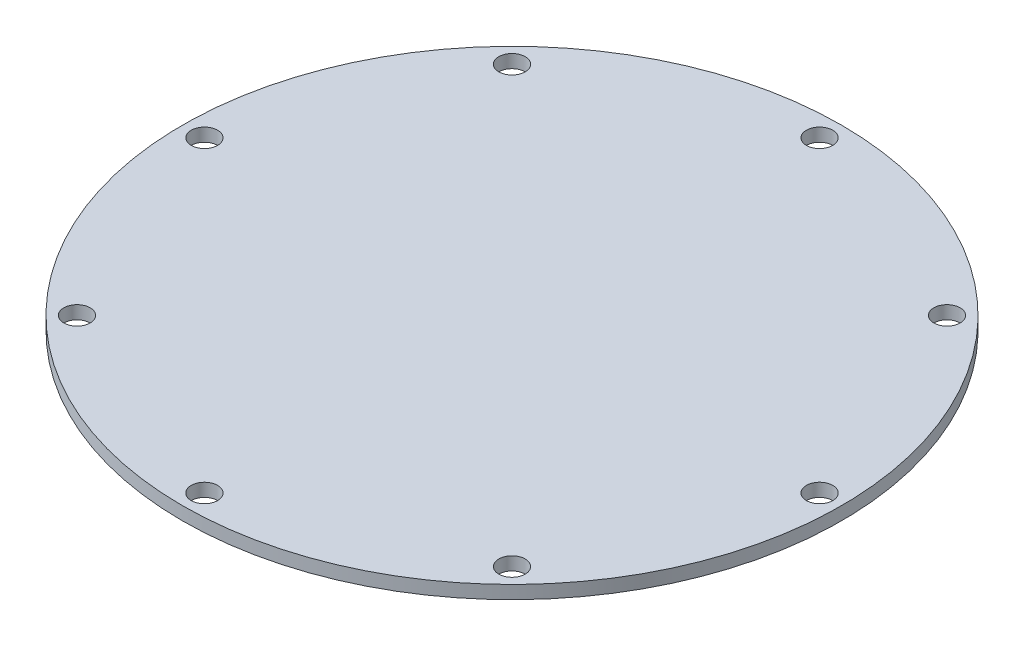
ISO-10303-21;
HEADER;
FILE_DESCRIPTION(('STEP AP214'),'2;1');
FILE_NAME('part.step','',(''),(''),'','','');
FILE_SCHEMA(('AUTOMOTIVE_DESIGN { 1 0 10303 214 1 1 1 1 }'));
ENDSEC;
DATA;
#1=APPLICATION_CONTEXT('core data for automotive mechanical design processes');
#2=APPLICATION_PROTOCOL_DEFINITION('international standard','automotive_design',2000,#1);
#3=PRODUCT_CONTEXT('',#1,'mechanical');
#4=PRODUCT('Part','Part','',(#3));
#5=PRODUCT_RELATED_PRODUCT_CATEGORY('part','',(#4));
#6=PRODUCT_DEFINITION_FORMATION('','',#4);
#7=PRODUCT_DEFINITION_CONTEXT('part definition',#1,'design');
#8=PRODUCT_DEFINITION('design','',#6,#7);
#9=PRODUCT_DEFINITION_SHAPE('','',#8);
#10=(LENGTH_UNIT() NAMED_UNIT(*) SI_UNIT(.MILLI.,.METRE.));
#11=(NAMED_UNIT(*) PLANE_ANGLE_UNIT() SI_UNIT($,.RADIAN.));
#12=(NAMED_UNIT(*) SI_UNIT($,.STERADIAN.) SOLID_ANGLE_UNIT());
#13=UNCERTAINTY_MEASURE_WITH_UNIT(LENGTH_MEASURE(1.E-05),#10,'distance_accuracy_value','');
#14=(GEOMETRIC_REPRESENTATION_CONTEXT(3) GLOBAL_UNCERTAINTY_ASSIGNED_CONTEXT((#13)) GLOBAL_UNIT_ASSIGNED_CONTEXT((#10,
#11,#12)) REPRESENTATION_CONTEXT('',''));
#15=CARTESIAN_POINT('',(0.,0.,0.));
#16=DIRECTION('',(0.,0.,1.));
#17=DIRECTION('',(1.,0.,0.));
#18=AXIS2_PLACEMENT_3D('',#15,#16,#17);
#19=CARTESIAN_POINT('',(0.,3.,0.));
#20=DIRECTION('',(0.,-1.,0.));
#21=DIRECTION('',(0.,0.,-1.));
#22=AXIS2_PLACEMENT_3D('',#19,#20,#21);
#23=CYLINDRICAL_SURFACE('',#22,75.);
#24=CARTESIAN_POINT('',(0.,3.,0.));
#25=DIRECTION('',(0.,1.,0.));
#26=DIRECTION('',(0.,0.,1.));
#27=AXIS2_PLACEMENT_3D('',#24,#25,#26);
#28=CIRCLE('',#27,75.);
#29=CARTESIAN_POINT('',(0.,3.,75.));
#30=VERTEX_POINT('',#29);
#31=EDGE_CURVE('E10',#30,#30,#28,.T.);
#32=ORIENTED_EDGE('',*,*,#31,.F.);
#33=EDGE_LOOP('',(#32));
#34=FACE_BOUND('',#33,.T.);
#35=CARTESIAN_POINT('',(0.,0.,0.));
#36=DIRECTION('',(0.,1.,0.));
#37=DIRECTION('',(0.,0.,1.));
#38=AXIS2_PLACEMENT_3D('',#35,#36,#37);
#39=CIRCLE('',#38,75.);
#40=CARTESIAN_POINT('',(0.,0.,75.));
#41=VERTEX_POINT('',#40);
#42=EDGE_CURVE('E36',#41,#41,#39,.T.);
#43=ORIENTED_EDGE('',*,*,#42,.T.);
#44=EDGE_LOOP('',(#43));
#45=FACE_BOUND('',#44,.T.);
#46=ADVANCED_FACE('F33',(#34,#45),#23,.T.);
#47=CARTESIAN_POINT('',(0.,3.,0.));
#48=DIRECTION('',(0.,1.,0.));
#49=DIRECTION('',(0.,0.,1.));
#50=AXIS2_PLACEMENT_3D('',#47,#48,#49);
#51=PLANE('',#50);
#52=CARTESIAN_POINT('',(-70.,3.,0.));
#53=DIRECTION('',(0.,1.,0.));
#54=DIRECTION('',(0.,0.,1.));
#55=AXIS2_PLACEMENT_3D('',#52,#53,#54);
#56=CIRCLE('',#55,3.00000000000001);
#57=CARTESIAN_POINT('',(-70.,3.,3.00000000000001));
#58=VERTEX_POINT('',#57);
#59=EDGE_CURVE('E70',#58,#58,#56,.T.);
#60=ORIENTED_EDGE('',*,*,#59,.F.);
#61=EDGE_LOOP('',(#60));
#62=FACE_BOUND('',#61,.T.);
#63=CARTESIAN_POINT('',(-49.4974746830583,3.,-49.4974746830583));
#64=DIRECTION('',(0.,1.,0.));
#65=DIRECTION('',(0.,0.,-1.));
#66=AXIS2_PLACEMENT_3D('',#63,#64,#65);
#67=CIRCLE('',#66,3.);
#68=CARTESIAN_POINT('',(-49.4974746830583,3.,-52.4974746830583));
#69=VERTEX_POINT('',#68);
#70=EDGE_CURVE('E78',#69,#69,#67,.T.);
#71=ORIENTED_EDGE('',*,*,#70,.F.);
#72=EDGE_LOOP('',(#71));
#73=FACE_BOUND('',#72,.T.);
#74=CARTESIAN_POINT('',(49.4974746830589,3.,49.4974746830578));
#75=DIRECTION('',(0.,1.,0.));
#76=DIRECTION('',(0.,0.,1.));
#77=AXIS2_PLACEMENT_3D('',#74,#75,#76);
#78=CIRCLE('',#77,3.00000000000001);
#79=CARTESIAN_POINT('',(49.4974746830589,3.,52.4974746830578));
#80=VERTEX_POINT('',#79);
#81=EDGE_CURVE('E71',#80,#80,#78,.T.);
#82=ORIENTED_EDGE('',*,*,#81,.F.);
#83=EDGE_LOOP('',(#82));
#84=FACE_BOUND('',#83,.T.);
#85=CARTESIAN_POINT('',(49.4974746830578,3.,-49.4974746830589));
#86=DIRECTION('',(0.,1.,0.));
#87=DIRECTION('',(0.,0.,-1.));
#88=AXIS2_PLACEMENT_3D('',#85,#86,#87);
#89=CIRCLE('',#88,3.);
#90=CARTESIAN_POINT('',(49.4974746830578,3.,-52.4974746830589));
#91=VERTEX_POINT('',#90);
#92=EDGE_CURVE('E83',#91,#91,#89,.T.);
#93=ORIENTED_EDGE('',*,*,#92,.F.);
#94=EDGE_LOOP('',(#93));
#95=FACE_BOUND('',#94,.T.);
#96=CARTESIAN_POINT('',(-49.4974746830583,3.,49.4974746830583));
#97=DIRECTION('',(0.,1.,0.));
#98=DIRECTION('',(0.,0.,1.));
#99=AXIS2_PLACEMENT_3D('',#96,#97,#98);
#100=CIRCLE('',#99,3.);
#101=CARTESIAN_POINT('',(-49.4974746830583,3.,52.4974746830583));
#102=VERTEX_POINT('',#101);
#103=EDGE_CURVE('E45',#102,#102,#100,.T.);
#104=ORIENTED_EDGE('',*,*,#103,.F.);
#105=EDGE_LOOP('',(#104));
#106=FACE_BOUND('',#105,.T.);
#107=CARTESIAN_POINT('',(0.,3.,70.));
#108=DIRECTION('',(0.,1.,0.));
#109=DIRECTION('',(0.,0.,1.));
#110=AXIS2_PLACEMENT_3D('',#107,#108,#109);
#111=CIRCLE('',#110,3.);
#112=CARTESIAN_POINT('',(0.,3.,73.));
#113=VERTEX_POINT('',#112);
#114=EDGE_CURVE('E52',#113,#113,#111,.T.);
#115=ORIENTED_EDGE('',*,*,#114,.F.);
#116=EDGE_LOOP('',(#115));
#117=FACE_BOUND('',#116,.T.);
#118=CARTESIAN_POINT('',(0.,3.,-70.));
#119=DIRECTION('',(0.,1.,0.));
#120=DIRECTION('',(0.,0.,-1.));
#121=AXIS2_PLACEMENT_3D('',#118,#119,#120);
#122=CIRCLE('',#121,3.);
#123=CARTESIAN_POINT('',(0.,3.,-73.));
#124=VERTEX_POINT('',#123);
#125=EDGE_CURVE('E58',#124,#124,#122,.T.);
#126=ORIENTED_EDGE('',*,*,#125,.F.);
#127=EDGE_LOOP('',(#126));
#128=FACE_BOUND('',#127,.T.);
#129=CARTESIAN_POINT('',(70.,3.,0.));
#130=DIRECTION('',(0.,1.,0.));
#131=DIRECTION('',(0.,0.,-1.));
#132=AXIS2_PLACEMENT_3D('',#129,#130,#131);
#133=CIRCLE('',#132,3.00000000000001);
#134=CARTESIAN_POINT('',(70.,3.,-3.00000000000003));
#135=VERTEX_POINT('',#134);
#136=EDGE_CURVE('E64',#135,#135,#133,.T.);
#137=ORIENTED_EDGE('',*,*,#136,.F.);
#138=EDGE_LOOP('',(#137));
#139=FACE_BOUND('',#138,.T.);
#140=ORIENTED_EDGE('',*,*,#31,.T.);
#141=EDGE_LOOP('',(#140));
#142=FACE_BOUND('',#141,.T.);
#143=ADVANCED_FACE('F103',(#62,#73,#84,#95,#106,#117,#128,#139,#142),#51,.T.);
#144=CARTESIAN_POINT('',(0.,0.,0.));
#145=DIRECTION('',(0.,1.,0.));
#146=DIRECTION('',(0.,0.,1.));
#147=AXIS2_PLACEMENT_3D('',#144,#145,#146);
#148=PLANE('',#147);
#149=CARTESIAN_POINT('',(-70.,0.,0.));
#150=DIRECTION('',(0.,1.,0.));
#151=DIRECTION('',(0.,0.,1.));
#152=AXIS2_PLACEMENT_3D('',#149,#150,#151);
#153=CIRCLE('',#152,3.00000000000001);
#154=CARTESIAN_POINT('',(-70.,0.,3.00000000000001));
#155=VERTEX_POINT('',#154);
#156=EDGE_CURVE('E43',#155,#155,#153,.T.);
#157=ORIENTED_EDGE('',*,*,#156,.T.);
#158=EDGE_LOOP('',(#157));
#159=FACE_BOUND('',#158,.T.);
#160=CARTESIAN_POINT('',(-49.4974746830583,0.,-49.4974746830583));
#161=DIRECTION('',(0.,1.,0.));
#162=DIRECTION('',(0.,0.,-1.));
#163=AXIS2_PLACEMENT_3D('',#160,#161,#162);
#164=CIRCLE('',#163,3.);
#165=CARTESIAN_POINT('',(-49.4974746830583,0.,-52.4974746830583));
#166=VERTEX_POINT('',#165);
#167=EDGE_CURVE('E49',#166,#166,#164,.T.);
#168=ORIENTED_EDGE('',*,*,#167,.T.);
#169=EDGE_LOOP('',(#168));
#170=FACE_BOUND('',#169,.T.);
#171=CARTESIAN_POINT('',(49.4974746830589,0.,49.4974746830578));
#172=DIRECTION('',(0.,1.,0.));
#173=DIRECTION('',(0.,0.,1.));
#174=AXIS2_PLACEMENT_3D('',#171,#172,#173);
#175=CIRCLE('',#174,3.00000000000001);
#176=CARTESIAN_POINT('',(49.4974746830589,0.,52.4974746830578));
#177=VERTEX_POINT('',#176);
#178=EDGE_CURVE('E74',#177,#177,#175,.T.);
#179=ORIENTED_EDGE('',*,*,#178,.T.);
#180=EDGE_LOOP('',(#179));
#181=FACE_BOUND('',#180,.T.);
#182=CARTESIAN_POINT('',(49.4974746830578,0.,-49.4974746830589));
#183=DIRECTION('',(0.,1.,0.));
#184=DIRECTION('',(0.,0.,-1.));
#185=AXIS2_PLACEMENT_3D('',#182,#183,#184);
#186=CIRCLE('',#185,3.);
#187=CARTESIAN_POINT('',(49.4974746830578,0.,-52.4974746830589));
#188=VERTEX_POINT('',#187);
#189=EDGE_CURVE('E75',#188,#188,#186,.T.);
#190=ORIENTED_EDGE('',*,*,#189,.T.);
#191=EDGE_LOOP('',(#190));
#192=FACE_BOUND('',#191,.T.);
#193=CARTESIAN_POINT('',(-49.4974746830583,0.,49.4974746830583));
#194=DIRECTION('',(0.,1.,0.));
#195=DIRECTION('',(0.,0.,1.));
#196=AXIS2_PLACEMENT_3D('',#193,#194,#195);
#197=CIRCLE('',#196,3.);
#198=CARTESIAN_POINT('',(-49.4974746830583,0.,52.4974746830583));
#199=VERTEX_POINT('',#198);
#200=EDGE_CURVE('E48',#199,#199,#197,.T.);
#201=ORIENTED_EDGE('',*,*,#200,.T.);
#202=EDGE_LOOP('',(#201));
#203=FACE_BOUND('',#202,.T.);
#204=CARTESIAN_POINT('',(0.,0.,70.));
#205=DIRECTION('',(0.,1.,0.));
#206=DIRECTION('',(0.,0.,1.));
#207=AXIS2_PLACEMENT_3D('',#204,#205,#206);
#208=CIRCLE('',#207,3.);
#209=CARTESIAN_POINT('',(0.,0.,73.));
#210=VERTEX_POINT('',#209);
#211=EDGE_CURVE('E55',#210,#210,#208,.T.);
#212=ORIENTED_EDGE('',*,*,#211,.T.);
#213=EDGE_LOOP('',(#212));
#214=FACE_BOUND('',#213,.T.);
#215=CARTESIAN_POINT('',(0.,0.,-70.));
#216=DIRECTION('',(0.,1.,0.));
#217=DIRECTION('',(0.,0.,-1.));
#218=AXIS2_PLACEMENT_3D('',#215,#216,#217);
#219=CIRCLE('',#218,3.);
#220=CARTESIAN_POINT('',(0.,0.,-73.));
#221=VERTEX_POINT('',#220);
#222=EDGE_CURVE('E61',#221,#221,#219,.T.);
#223=ORIENTED_EDGE('',*,*,#222,.T.);
#224=EDGE_LOOP('',(#223));
#225=FACE_BOUND('',#224,.T.);
#226=CARTESIAN_POINT('',(70.,0.,0.));
#227=DIRECTION('',(0.,1.,0.));
#228=DIRECTION('',(0.,0.,-1.));
#229=AXIS2_PLACEMENT_3D('',#226,#227,#228);
#230=CIRCLE('',#229,3.00000000000001);
#231=CARTESIAN_POINT('',(70.,0.,-3.00000000000003));
#232=VERTEX_POINT('',#231);
#233=EDGE_CURVE('E67',#232,#232,#230,.T.);
#234=ORIENTED_EDGE('',*,*,#233,.T.);
#235=EDGE_LOOP('',(#234));
#236=FACE_BOUND('',#235,.T.);
#237=ORIENTED_EDGE('',*,*,#42,.F.);
#238=EDGE_LOOP('',(#237));
#239=FACE_BOUND('',#238,.T.);
#240=ADVANCED_FACE('F93',(#159,#170,#181,#192,#203,#214,#225,#236,#239),#148,.F.);
#241=CARTESIAN_POINT('',(70.,0.,0.));
#242=DIRECTION('',(0.,1.,0.));
#243=DIRECTION('',(0.,0.,1.));
#244=AXIS2_PLACEMENT_3D('',#241,#242,#243);
#245=CYLINDRICAL_SURFACE('',#244,3.00000000000001);
#246=ORIENTED_EDGE('',*,*,#233,.F.);
#247=EDGE_LOOP('',(#246));
#248=FACE_BOUND('',#247,.T.);
#249=ORIENTED_EDGE('',*,*,#136,.T.);
#250=EDGE_LOOP('',(#249));
#251=FACE_BOUND('',#250,.T.);
#252=ADVANCED_FACE('F121',(#248,#251),#245,.F.);
#253=CARTESIAN_POINT('',(0.,0.,-70.));
#254=DIRECTION('',(0.,1.,0.));
#255=DIRECTION('',(0.,0.,1.));
#256=AXIS2_PLACEMENT_3D('',#253,#254,#255);
#257=CYLINDRICAL_SURFACE('',#256,3.);
#258=ORIENTED_EDGE('',*,*,#222,.F.);
#259=EDGE_LOOP('',(#258));
#260=FACE_BOUND('',#259,.T.);
#261=ORIENTED_EDGE('',*,*,#125,.T.);
#262=EDGE_LOOP('',(#261));
#263=FACE_BOUND('',#262,.T.);
#264=ADVANCED_FACE('F123',(#260,#263),#257,.F.);
#265=CARTESIAN_POINT('',(0.,0.,70.));
#266=DIRECTION('',(0.,1.,0.));
#267=DIRECTION('',(0.,0.,1.));
#268=AXIS2_PLACEMENT_3D('',#265,#266,#267);
#269=CYLINDRICAL_SURFACE('',#268,3.);
#270=ORIENTED_EDGE('',*,*,#211,.F.);
#271=EDGE_LOOP('',(#270));
#272=FACE_BOUND('',#271,.T.);
#273=ORIENTED_EDGE('',*,*,#114,.T.);
#274=EDGE_LOOP('',(#273));
#275=FACE_BOUND('',#274,.T.);
#276=ADVANCED_FACE('F130',(#272,#275),#269,.F.);
#277=CARTESIAN_POINT('',(-49.4974746830583,0.,49.4974746830583));
#278=DIRECTION('',(0.,1.,0.));
#279=DIRECTION('',(0.,0.,1.));
#280=AXIS2_PLACEMENT_3D('',#277,#278,#279);
#281=CYLINDRICAL_SURFACE('',#280,3.);
#282=ORIENTED_EDGE('',*,*,#200,.F.);
#283=EDGE_LOOP('',(#282));
#284=FACE_BOUND('',#283,.T.);
#285=ORIENTED_EDGE('',*,*,#103,.T.);
#286=EDGE_LOOP('',(#285));
#287=FACE_BOUND('',#286,.T.);
#288=ADVANCED_FACE('F169',(#284,#287),#281,.F.);
#289=CARTESIAN_POINT('',(49.4974746830578,0.,-49.4974746830589));
#290=DIRECTION('',(0.,1.,0.));
#291=DIRECTION('',(0.,0.,1.));
#292=AXIS2_PLACEMENT_3D('',#289,#290,#291);
#293=CYLINDRICAL_SURFACE('',#292,3.);
#294=ORIENTED_EDGE('',*,*,#189,.F.);
#295=EDGE_LOOP('',(#294));
#296=FACE_BOUND('',#295,.T.);
#297=ORIENTED_EDGE('',*,*,#92,.T.);
#298=EDGE_LOOP('',(#297));
#299=FACE_BOUND('',#298,.T.);
#300=ADVANCED_FACE('F179',(#296,#299),#293,.F.);
#301=CARTESIAN_POINT('',(49.4974746830589,0.,49.4974746830578));
#302=DIRECTION('',(0.,1.,0.));
#303=DIRECTION('',(0.,0.,1.));
#304=AXIS2_PLACEMENT_3D('',#301,#302,#303);
#305=CYLINDRICAL_SURFACE('',#304,3.00000000000001);
#306=ORIENTED_EDGE('',*,*,#178,.F.);
#307=EDGE_LOOP('',(#306));
#308=FACE_BOUND('',#307,.T.);
#309=ORIENTED_EDGE('',*,*,#81,.T.);
#310=EDGE_LOOP('',(#309));
#311=FACE_BOUND('',#310,.T.);
#312=ADVANCED_FACE('F189',(#308,#311),#305,.F.);
#313=CARTESIAN_POINT('',(-49.4974746830583,0.,-49.4974746830583));
#314=DIRECTION('',(0.,1.,0.));
#315=DIRECTION('',(0.,0.,1.));
#316=AXIS2_PLACEMENT_3D('',#313,#314,#315);
#317=CYLINDRICAL_SURFACE('',#316,3.);
#318=ORIENTED_EDGE('',*,*,#167,.F.);
#319=EDGE_LOOP('',(#318));
#320=FACE_BOUND('',#319,.T.);
#321=ORIENTED_EDGE('',*,*,#70,.T.);
#322=EDGE_LOOP('',(#321));
#323=FACE_BOUND('',#322,.T.);
#324=ADVANCED_FACE('F99',(#320,#323),#317,.F.);
#325=CARTESIAN_POINT('',(-70.,0.,0.));
#326=DIRECTION('',(0.,1.,0.));
#327=DIRECTION('',(0.,0.,1.));
#328=AXIS2_PLACEMENT_3D('',#325,#326,#327);
#329=CYLINDRICAL_SURFACE('',#328,3.00000000000001);
#330=ORIENTED_EDGE('',*,*,#156,.F.);
#331=EDGE_LOOP('',(#330));
#332=FACE_BOUND('',#331,.T.);
#333=ORIENTED_EDGE('',*,*,#59,.T.);
#334=EDGE_LOOP('',(#333));
#335=FACE_BOUND('',#334,.T.);
#336=ADVANCED_FACE('F96',(#332,#335),#329,.F.);
#337=CLOSED_SHELL('',(#46,#143,#240,#252,#264,#276,#288,#300,#312,#324,#336));
#338=MANIFOLD_SOLID_BREP('B2',#337);
#339=ADVANCED_BREP_SHAPE_REPRESENTATION('',(#18,#338),#14);
#340=SHAPE_DEFINITION_REPRESENTATION(#9,#339);
ENDSEC;
END-ISO-10303-21;
